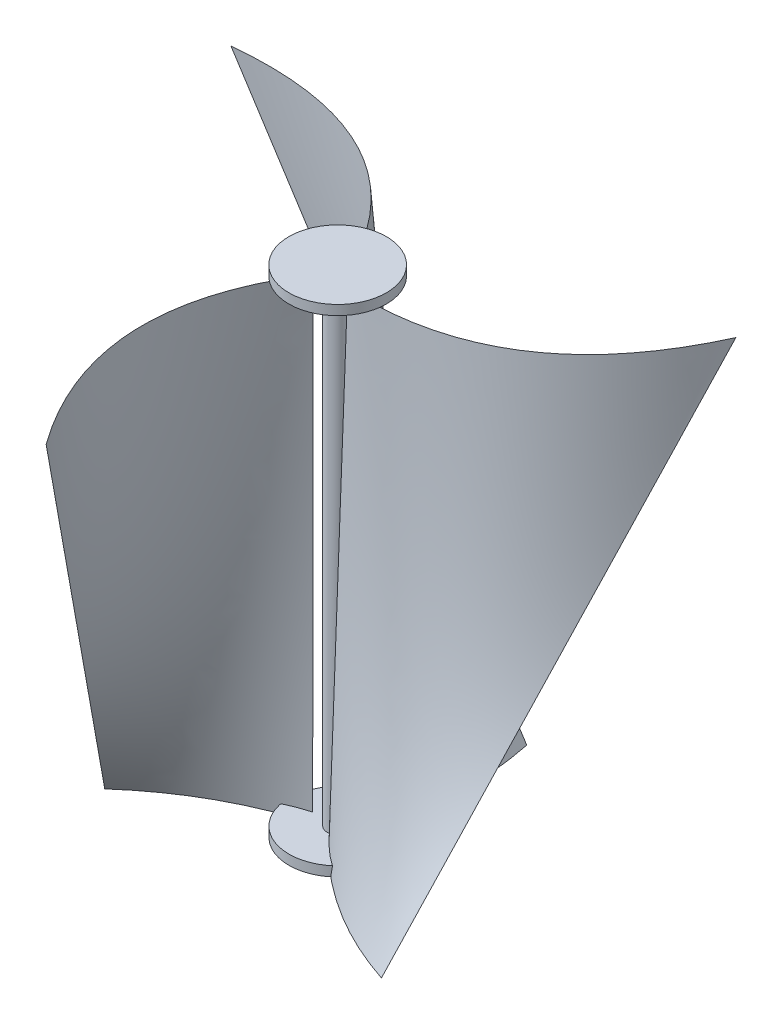
ISO-10303-21;
HEADER;
FILE_DESCRIPTION(('STEP AP214'),'2;1');
FILE_NAME('part.step','',(''),(''),'','','');
FILE_SCHEMA(('AUTOMOTIVE_DESIGN { 1 0 10303 214 1 1 1 1 }'));
ENDSEC;
DATA;
#1=APPLICATION_CONTEXT('core data for automotive mechanical design processes');
#2=APPLICATION_PROTOCOL_DEFINITION('international standard','automotive_design',2000,#1);
#3=PRODUCT_CONTEXT('',#1,'mechanical');
#4=PRODUCT('Part','Part','',(#3));
#5=PRODUCT_RELATED_PRODUCT_CATEGORY('part','',(#4));
#6=PRODUCT_DEFINITION_FORMATION('','',#4);
#7=PRODUCT_DEFINITION_CONTEXT('part definition',#1,'design');
#8=PRODUCT_DEFINITION('design','',#6,#7);
#9=PRODUCT_DEFINITION_SHAPE('','',#8);
#10=(LENGTH_UNIT() NAMED_UNIT(*) SI_UNIT(.MILLI.,.METRE.));
#11=(NAMED_UNIT(*) PLANE_ANGLE_UNIT() SI_UNIT($,.RADIAN.));
#12=(NAMED_UNIT(*) SI_UNIT($,.STERADIAN.) SOLID_ANGLE_UNIT());
#13=UNCERTAINTY_MEASURE_WITH_UNIT(LENGTH_MEASURE(1.E-05),#10,'distance_accuracy_value','');
#14=(GEOMETRIC_REPRESENTATION_CONTEXT(3) GLOBAL_UNCERTAINTY_ASSIGNED_CONTEXT((#13)) GLOBAL_UNIT_ASSIGNED_CONTEXT((#10,
#11,#12)) REPRESENTATION_CONTEXT('',''));
#15=CARTESIAN_POINT('',(0.,0.,0.));
#16=DIRECTION('',(0.,0.,1.));
#17=DIRECTION('',(1.,0.,0.));
#18=AXIS2_PLACEMENT_3D('',#15,#16,#17);
#19=CARTESIAN_POINT('',(0.,510.,0.));
#20=DIRECTION('',(0.,-1.,0.));
#21=DIRECTION('',(0.,0.,-1.));
#22=AXIS2_PLACEMENT_3D('',#19,#20,#21);
#23=CYLINDRICAL_SURFACE('',#22,50.1082102927056);
#24=CARTESIAN_POINT('',(0.,510.,0.));
#25=DIRECTION('',(0.,1.,0.));
#26=DIRECTION('',(0.,0.,1.));
#27=AXIS2_PLACEMENT_3D('',#24,#25,#26);
#28=CIRCLE('',#27,50.1082102927056);
#29=CARTESIAN_POINT('',(0.,510.,50.1082102927056));
#30=VERTEX_POINT('',#29);
#31=EDGE_CURVE('E11',#30,#30,#28,.T.);
#32=ORIENTED_EDGE('',*,*,#31,.F.);
#33=EDGE_LOOP('',(#32));
#34=FACE_BOUND('',#33,.T.);
#35=CARTESIAN_POINT('',(0.,500.,0.));
#36=DIRECTION('',(0.,1.,0.));
#37=DIRECTION('',(0.,0.,1.));
#38=AXIS2_PLACEMENT_3D('',#35,#36,#37);
#39=CIRCLE('',#38,50.1082102927056);
#40=CARTESIAN_POINT('',(0.,500.,50.1082102927056));
#41=VERTEX_POINT('',#40);
#42=EDGE_CURVE('E64',#41,#41,#39,.T.);
#43=ORIENTED_EDGE('',*,*,#42,.T.);
#44=EDGE_LOOP('',(#43));
#45=FACE_BOUND('',#44,.T.);
#46=ADVANCED_FACE('F58',(#34,#45),#23,.T.);
#47=CARTESIAN_POINT('',(0.,510.,0.));
#48=DIRECTION('',(0.,1.,0.));
#49=DIRECTION('',(0.,0.,1.));
#50=AXIS2_PLACEMENT_3D('',#47,#48,#49);
#51=PLANE('',#50);
#52=ORIENTED_EDGE('',*,*,#31,.T.);
#53=EDGE_LOOP('',(#52));
#54=FACE_BOUND('',#53,.T.);
#55=ADVANCED_FACE('F73',(#54),#51,.T.);
#56=CARTESIAN_POINT('',(0.,500.,0.));
#57=DIRECTION('',(0.,1.,0.));
#58=DIRECTION('',(0.,0.,1.));
#59=AXIS2_PLACEMENT_3D('',#56,#57,#58);
#60=PLANE('',#59);
#61=ORIENTED_EDGE('',*,*,#42,.F.);
#62=EDGE_LOOP('',(#61));
#63=FACE_BOUND('',#62,.T.);
#64=ADVANCED_FACE('F71',(#63),#60,.F.);
#65=CLOSED_SHELL('',(#46,#55,#64));
#66=MANIFOLD_SOLID_BREP('B2',#65);
#67=CARTESIAN_POINT('',(15.1071014044264,0.,-179.36085832439));
#68=CARTESIAN_POINT('',(-259.631317264926,500.,-149.898210912959));
#69=CARTESIAN_POINT('',(31.3332622135374,0.,-100.554858156022));
#70=CARTESIAN_POINT('',(-80.2877369504897,500.,-167.786426239698));
#71=CARTESIAN_POINT('',(12.8431208432976,0.,-22.2449378283388));
#72=CARTESIAN_POINT('',(-2.7601152522813,500.,-17.6750475255172));
#73=B_SPLINE_SURFACE_WITH_KNOTS('',2,1,((#67,#68),(#69,#70),(#71,#72)),.UNSPECIFIED.,.F.,.F.,
.F.,(3,3),(2,2),(0.,1.),(0.,1.),.UNSPECIFIED.);
#74=CARTESIAN_POINT('',(15.1071014044264,0.,-179.36085832439));
#75=CARTESIAN_POINT('',(31.3332622135374,0.,-100.554858156022));
#76=CARTESIAN_POINT('',(12.8431208432976,0.,-22.2449378283388));
#77=B_SPLINE_CURVE_WITH_KNOTS('',2,(#74,#75,#76),.UNSPECIFIED.,.F.,.F.,(3,3),(0.,1.),.UNSPECIFIED.);
#78=CARTESIAN_POINT('',(15.1071014044264,0.,-179.36085832439));
#79=VERTEX_POINT('',#78);
#80=CARTESIAN_POINT('',(12.8431208432976,0.,-22.2449378283388));
#81=VERTEX_POINT('',#80);
#82=EDGE_CURVE('E59',#79,#81,#77,.T.);
#83=DIRECTION('',(-0.0311899867216337,0.999471729152109,0.00913495232599306));
#84=VECTOR('',#83,1.);
#85=CARTESIAN_POINT('',(5.04150279550817,250.,-19.959992676928));
#86=LINE('',#85,#84);
#87=CARTESIAN_POINT('',(-2.7601152522813,500.,-17.6750475255172));
#88=VERTEX_POINT('',#87);
#89=EDGE_CURVE('E118',#81,#88,#86,.T.);
#90=CARTESIAN_POINT('',(-259.631317264926,500.,-149.898210912959));
#91=CARTESIAN_POINT('',(-80.2877369504897,500.,-167.786426239698));
#92=CARTESIAN_POINT('',(-2.7601152522813,500.,-17.6750475255172));
#93=B_SPLINE_CURVE_WITH_KNOTS('',2,(#90,#91,#92),.UNSPECIFIED.,.F.,.F.,(3,3),(0.,1.),.UNSPECIFIED.);
#94=CARTESIAN_POINT('',(-259.631317264926,500.,-149.898210912959));
#95=VERTEX_POINT('',#94);
#96=EDGE_CURVE('E126',#88,#95,#93,.F.);
#97=DIRECTION('',(0.480925812316271,-0.875243103322701,-0.0515739579049676));
#98=VECTOR('',#97,1.);
#99=CARTESIAN_POINT('',(-122.26210793025,250.,-164.629534618675));
#100=LINE('',#99,#98);
#101=EDGE_CURVE('E111',#95,#79,#100,.T.);
#102=ORIENTED_EDGE('',*,*,#82,.T.);
#103=ORIENTED_EDGE('',*,*,#89,.T.);
#104=ORIENTED_EDGE('',*,*,#96,.T.);
#105=ORIENTED_EDGE('',*,*,#101,.T.);
#106=EDGE_LOOP('',(#102,#103,#104,#105));
#107=FACE_BOUND('',#106,.T.);
#108=ADVANCED_FACE('F112',(#107),#73,.T.);
#109=OPEN_SHELL('',(#108));
#110=SHELL_BASED_SURFACE_MODEL('B6',(#109));
#111=CARTESIAN_POINT('',(147.77750905129,0.,102.763562755977));
#112=CARTESIAN_POINT('',(259.631317264924,500.,-149.898210912962));
#113=CARTESIAN_POINT('',(71.4164305302871,0.,77.4128301383739));
#114=CARTESIAN_POINT('',(185.451176009027,500.,14.3619933083632));
#115=CARTESIAN_POINT('',(12.8431208432979,0.,22.2449378283386));
#116=CARTESIAN_POINT('',(16.6870977963358,500.,6.4471938369102));
#117=B_SPLINE_SURFACE_WITH_KNOTS('',2,1,((#111,#112),(#113,#114),(#115,#116)),.UNSPECIFIED.,.F.,
.F.,.F.,(3,3),(2,2),(0.,1.),(0.,1.),.UNSPECIFIED.);
#118=CARTESIAN_POINT('',(147.77750905129,0.,102.763562755977));
#119=CARTESIAN_POINT('',(71.4164305302871,0.,77.4128301383739));
#120=CARTESIAN_POINT('',(12.8431208432979,0.,22.2449378283386));
#121=B_SPLINE_CURVE_WITH_KNOTS('',2,(#118,#119,#120),.UNSPECIFIED.,.F.,.F.,(3,3),(0.,1.),.UNSPECIFIED.);
#122=CARTESIAN_POINT('',(147.77750905129,0.,102.763562755977));
#123=VERTEX_POINT('',#122);
#124=CARTESIAN_POINT('',(12.8431208432979,0.,22.2449378283386));
#125=VERTEX_POINT('',#124);
#126=EDGE_CURVE('E108',#123,#125,#121,.T.);
#127=DIRECTION('',(0.00768389258414727,0.999471729152109,-0.0315787970076306));
#128=VECTOR('',#127,1.);
#129=CARTESIAN_POINT('',(14.7651093198169,250.,14.3460658326244));
#130=LINE('',#129,#128);
#131=CARTESIAN_POINT('',(16.6870977963358,500.,6.4471938369102));
#132=VERTEX_POINT('',#131);
#133=EDGE_CURVE('E188',#125,#132,#130,.T.);
#134=CARTESIAN_POINT('',(259.631317264924,500.,-149.898210912962));
#135=CARTESIAN_POINT('',(185.451176009027,500.,14.3619933083632));
#136=CARTESIAN_POINT('',(16.6870977963358,500.,6.4471938369102));
#137=B_SPLINE_CURVE_WITH_KNOTS('',2,(#134,#135,#136),.UNSPECIFIED.,.F.,.F.,(3,3),(0.,1.),.UNSPECIFIED.);
#138=CARTESIAN_POINT('',(259.631317264924,500.,-149.898210912962));
#139=VERTEX_POINT('',#138);
#140=EDGE_CURVE('E196',#132,#139,#137,.F.);
#141=DIRECTION('',(-0.195798548438726,-0.875243103322701,0.44228094975404));
#142=VECTOR('',#141,1.);
#143=CARTESIAN_POINT('',(203.704413158107,250.,-23.5673240784929));
#144=LINE('',#143,#142);
#145=EDGE_CURVE('E184',#139,#123,#144,.T.);
#146=ORIENTED_EDGE('',*,*,#126,.T.);
#147=ORIENTED_EDGE('',*,*,#133,.T.);
#148=ORIENTED_EDGE('',*,*,#140,.T.);
#149=ORIENTED_EDGE('',*,*,#145,.T.);
#150=EDGE_LOOP('',(#146,#147,#148,#149));
#151=FACE_BOUND('',#150,.T.);
#152=ADVANCED_FACE('F182',(#151),#117,.T.);
#153=OPEN_SHELL('',(#152));
#154=SHELL_BASED_SURFACE_MODEL('B55',(#153));
#155=CARTESIAN_POINT('',(-162.884610455718,0.,76.5972955684128));
#156=CARTESIAN_POINT('',(0.,500.,299.796421825923));
#157=CARTESIAN_POINT('',(-102.749692743825,0.,23.1420280176477));
#158=CARTESIAN_POINT('',(-105.163439058539,500.,153.424432931335));
#159=CARTESIAN_POINT('',(-25.6862416865957,0.,0.));
#160=CARTESIAN_POINT('',(-13.9269825440547,500.,11.227853688607));
#161=B_SPLINE_SURFACE_WITH_KNOTS('',2,1,((#155,#156),(#157,#158),(#159,#160)),.UNSPECIFIED.,.F.,
.F.,.F.,(3,3),(2,2),(0.,1.),(0.,1.),.UNSPECIFIED.);
#162=CARTESIAN_POINT('',(-162.884610455718,0.,76.5972955684128));
#163=CARTESIAN_POINT('',(-102.749692743825,0.,23.1420280176477));
#164=CARTESIAN_POINT('',(-25.6862416865957,0.,0.));
#165=B_SPLINE_CURVE_WITH_KNOTS('',2,(#162,#163,#164),.UNSPECIFIED.,.F.,.F.,(3,3),(0.,1.),.UNSPECIFIED.);
#166=CARTESIAN_POINT('',(-162.884610455718,0.,76.5972955684128));
#167=VERTEX_POINT('',#166);
#168=CARTESIAN_POINT('',(-25.6862416865957,0.,0.));
#169=VERTEX_POINT('',#168);
#170=EDGE_CURVE('E179',#167,#169,#165,.T.);
#171=DIRECTION('',(0.0235060941374864,0.999471729152109,0.0224438446816378));
#172=VECTOR('',#171,1.);
#173=CARTESIAN_POINT('',(-19.8066121153252,250.,5.61392684430349));
#174=LINE('',#173,#172);
#175=CARTESIAN_POINT('',(-13.9269825440547,500.,11.227853688607));
#176=VERTEX_POINT('',#175);
#177=EDGE_CURVE('E260',#169,#176,#174,.T.);
#178=CARTESIAN_POINT('',(0.,500.,299.796421825923));
#179=CARTESIAN_POINT('',(-105.163439058539,500.,153.424432931335));
#180=CARTESIAN_POINT('',(-13.9269825440547,500.,11.227853688607));
#181=B_SPLINE_CURVE_WITH_KNOTS('',2,(#178,#179,#180),.UNSPECIFIED.,.F.,.F.,(3,3),(0.,1.),.UNSPECIFIED.);
#182=CARTESIAN_POINT('',(0.,500.,299.796421825923));
#183=VERTEX_POINT('',#182);
#184=EDGE_CURVE('E264',#176,#183,#181,.F.);
#185=DIRECTION('',(-0.285127263877543,-0.875243103322701,-0.390706991849076));
#186=VECTOR('',#185,1.);
#187=CARTESIAN_POINT('',(-81.4423052278588,250.,188.196858697168));
#188=LINE('',#187,#186);
#189=EDGE_CURVE('E253',#183,#167,#188,.T.);
#190=ORIENTED_EDGE('',*,*,#170,.T.);
#191=ORIENTED_EDGE('',*,*,#177,.T.);
#192=ORIENTED_EDGE('',*,*,#184,.T.);
#193=ORIENTED_EDGE('',*,*,#189,.T.);
#194=EDGE_LOOP('',(#190,#191,#192,#193));
#195=FACE_BOUND('',#194,.T.);
#196=ADVANCED_FACE('F248',(#195),#161,.T.);
#197=OPEN_SHELL('',(#196));
#198=SHELL_BASED_SURFACE_MODEL('B103',(#197));
#199=CARTESIAN_POINT('',(0.,10.,0.));
#200=DIRECTION('',(0.,-1.,0.));
#201=DIRECTION('',(0.,0.,-1.));
#202=AXIS2_PLACEMENT_3D('',#199,#200,#201);
#203=CYLINDRICAL_SURFACE('',#202,50.);
#204=CARTESIAN_POINT('',(0.,10.,0.));
#205=DIRECTION('',(0.,1.,0.));
#206=DIRECTION('',(0.,0.,1.));
#207=AXIS2_PLACEMENT_3D('',#204,#205,#206);
#208=CIRCLE('',#207,50.);
#209=CARTESIAN_POINT('',(0.,10.,50.));
#210=VERTEX_POINT('',#209);
#211=EDGE_CURVE('E250',#210,#210,#208,.T.);
#212=ORIENTED_EDGE('',*,*,#211,.F.);
#213=EDGE_LOOP('',(#212));
#214=FACE_BOUND('',#213,.T.);
#215=CARTESIAN_POINT('',(0.,0.,0.));
#216=DIRECTION('',(0.,1.,0.));
#217=DIRECTION('',(0.,0.,1.));
#218=AXIS2_PLACEMENT_3D('',#215,#216,#217);
#219=CIRCLE('',#218,50.);
#220=CARTESIAN_POINT('',(0.,0.,50.));
#221=VERTEX_POINT('',#220);
#222=EDGE_CURVE('E309',#221,#221,#219,.T.);
#223=ORIENTED_EDGE('',*,*,#222,.T.);
#224=EDGE_LOOP('',(#223));
#225=FACE_BOUND('',#224,.T.);
#226=ADVANCED_FACE('F307',(#214,#225),#203,.T.);
#227=CARTESIAN_POINT('',(0.,10.,0.));
#228=DIRECTION('',(0.,1.,0.));
#229=DIRECTION('',(0.,0.,1.));
#230=AXIS2_PLACEMENT_3D('',#227,#228,#229);
#231=PLANE('',#230);
#232=CARTESIAN_POINT('',(0.,10.,0.));
#233=DIRECTION('',(0.,1.,0.));
#234=DIRECTION('',(0.,0.,1.));
#235=AXIS2_PLACEMENT_3D('',#232,#233,#234);
#236=CIRCLE('',#235,10.8654551540842);
#237=CARTESIAN_POINT('',(0.,10.,10.8654551540842));
#238=VERTEX_POINT('',#237);
#239=EDGE_CURVE('E317',#238,#238,#236,.F.);
#240=ORIENTED_EDGE('',*,*,#239,.T.);
#241=EDGE_LOOP('',(#240));
#242=FACE_BOUND('',#241,.T.);
#243=ORIENTED_EDGE('',*,*,#211,.T.);
#244=EDGE_LOOP('',(#243));
#245=FACE_BOUND('',#244,.T.);
#246=ADVANCED_FACE('F342',(#242,#245),#231,.T.);
#247=CARTESIAN_POINT('',(0.,0.,0.));
#248=DIRECTION('',(0.,1.,0.));
#249=DIRECTION('',(0.,0.,1.));
#250=AXIS2_PLACEMENT_3D('',#247,#248,#249);
#251=PLANE('',#250);
#252=ORIENTED_EDGE('',*,*,#222,.F.);
#253=EDGE_LOOP('',(#252));
#254=FACE_BOUND('',#253,.T.);
#255=ADVANCED_FACE('F334',(#254),#251,.F.);
#256=CARTESIAN_POINT('',(0.,500.,0.));
#257=DIRECTION('',(0.,-1.,0.));
#258=DIRECTION('',(0.,0.,-1.));
#259=AXIS2_PLACEMENT_3D('',#256,#257,#258);
#260=CYLINDRICAL_SURFACE('',#259,10.8654551540842);
#261=ORIENTED_EDGE('',*,*,#239,.F.);
#262=EDGE_LOOP('',(#261));
#263=FACE_BOUND('',#262,.T.);
#264=CARTESIAN_POINT('',(0.,500.,0.));
#265=DIRECTION('',(0.,1.,0.));
#266=DIRECTION('',(0.,0.,1.));
#267=AXIS2_PLACEMENT_3D('',#264,#265,#266);
#268=CIRCLE('',#267,10.8654551540842);
#269=CARTESIAN_POINT('',(0.,500.,10.8654551540842));
#270=VERTEX_POINT('',#269);
#271=EDGE_CURVE('E322',#270,#270,#268,.T.);
#272=ORIENTED_EDGE('',*,*,#271,.F.);
#273=EDGE_LOOP('',(#272));
#274=FACE_BOUND('',#273,.T.);
#275=ADVANCED_FACE('F332',(#263,#274),#260,.T.);
#276=CARTESIAN_POINT('',(0.,500.,0.));
#277=DIRECTION('',(0.,1.,0.));
#278=DIRECTION('',(0.,0.,1.));
#279=AXIS2_PLACEMENT_3D('',#276,#277,#278);
#280=PLANE('',#279);
#281=ORIENTED_EDGE('',*,*,#271,.T.);
#282=EDGE_LOOP('',(#281));
#283=FACE_BOUND('',#282,.T.);
#284=ADVANCED_FACE('F328',(#283),#280,.T.);
#285=CLOSED_SHELL('',(#226,#246,#255,#275,#284));
#286=MANIFOLD_SOLID_BREP('B174',#285);
#287=ADVANCED_BREP_SHAPE_REPRESENTATION('',(#18,#66,#286),#14);
#288=MANIFOLD_SURFACE_SHAPE_REPRESENTATION('',(#18,#110,#154,#198),#14);
#289=SHAPE_REPRESENTATION('',(#18),#14);
#290=SHAPE_DEFINITION_REPRESENTATION(#9,#289);
#291=SHAPE_REPRESENTATION_RELATIONSHIP('','',#289,#287);
#292=SHAPE_REPRESENTATION_RELATIONSHIP('','',#289,#288);
ENDSEC;
END-ISO-10303-21;
